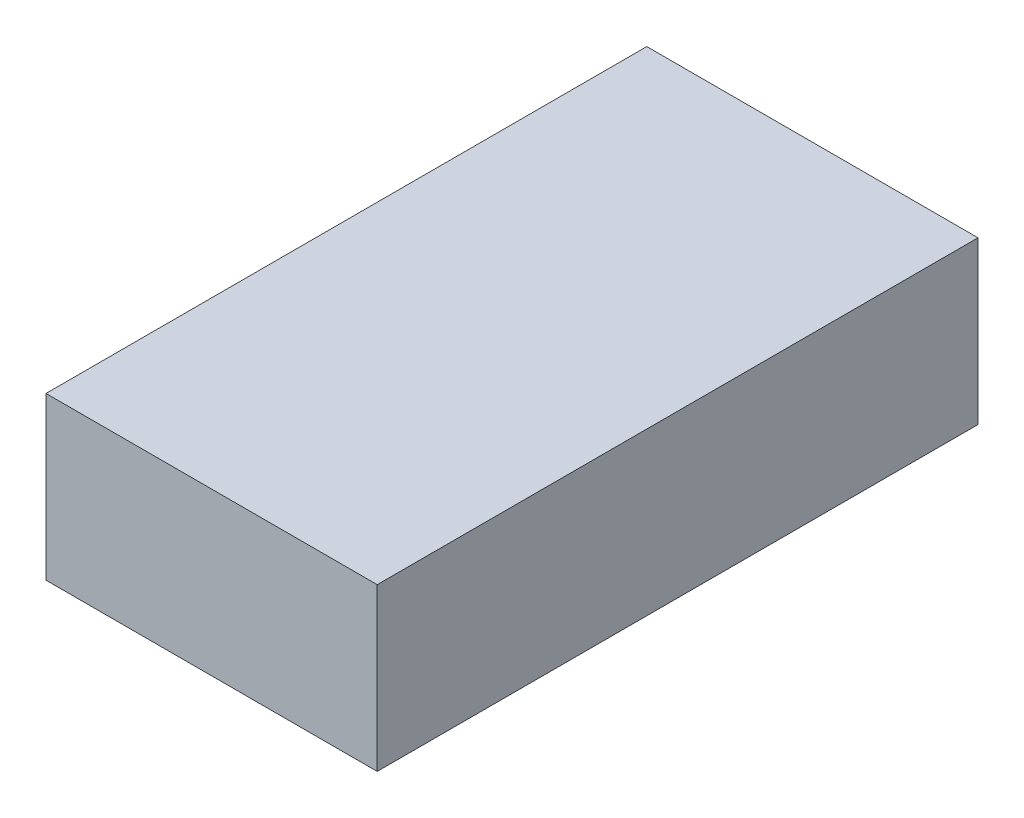
ISO-10303-21;
HEADER;
FILE_DESCRIPTION(('STEP AP214'),'2;1');
FILE_NAME('part.step','',(''),(''),'','','');
FILE_SCHEMA(('AUTOMOTIVE_DESIGN { 1 0 10303 214 1 1 1 1 }'));
ENDSEC;
DATA;
#1=APPLICATION_CONTEXT('core data for automotive mechanical design processes');
#2=APPLICATION_PROTOCOL_DEFINITION('international standard','automotive_design',2000,#1);
#3=PRODUCT_CONTEXT('',#1,'mechanical');
#4=PRODUCT('Part','Part','',(#3));
#5=PRODUCT_RELATED_PRODUCT_CATEGORY('part','',(#4));
#6=PRODUCT_DEFINITION_FORMATION('','',#4);
#7=PRODUCT_DEFINITION_CONTEXT('part definition',#1,'design');
#8=PRODUCT_DEFINITION('design','',#6,#7);
#9=PRODUCT_DEFINITION_SHAPE('','',#8);
#10=(LENGTH_UNIT() NAMED_UNIT(*) SI_UNIT(.MILLI.,.METRE.));
#11=(NAMED_UNIT(*) PLANE_ANGLE_UNIT() SI_UNIT($,.RADIAN.));
#12=(NAMED_UNIT(*) SI_UNIT($,.STERADIAN.) SOLID_ANGLE_UNIT());
#13=UNCERTAINTY_MEASURE_WITH_UNIT(LENGTH_MEASURE(1.E-05),#10,'distance_accuracy_value','');
#14=(GEOMETRIC_REPRESENTATION_CONTEXT(3) GLOBAL_UNCERTAINTY_ASSIGNED_CONTEXT((#13)) GLOBAL_UNIT_ASSIGNED_CONTEXT((#10,
#11,#12)) REPRESENTATION_CONTEXT('',''));
#15=CARTESIAN_POINT('',(0.,0.,0.));
#16=DIRECTION('',(0.,0.,1.));
#17=DIRECTION('',(1.,0.,0.));
#18=AXIS2_PLACEMENT_3D('',#15,#16,#17);
#19=CARTESIAN_POINT('',(21.5,21.,-39.));
#20=DIRECTION('',(-1.,0.,0.));
#21=DIRECTION('',(0.,0.,1.));
#22=AXIS2_PLACEMENT_3D('',#19,#20,#21);
#23=PLANE('',#22);
#24=DIRECTION('',(0.,0.,-1.));
#25=VECTOR('',#24,1.);
#26=CARTESIAN_POINT('',(21.5,0.,-39.));
#27=LINE('',#26,#25);
#28=CARTESIAN_POINT('',(21.5,0.,39.));
#29=VERTEX_POINT('',#28);
#30=CARTESIAN_POINT('',(21.5,0.,-39.));
#31=VERTEX_POINT('',#30);
#32=EDGE_CURVE('E117',#29,#31,#27,.T.);
#33=ORIENTED_EDGE('',*,*,#32,.T.);
#34=DIRECTION('',(0.,-1.,0.));
#35=VECTOR('',#34,1.);
#36=CARTESIAN_POINT('',(21.5,21.,-39.));
#37=LINE('',#36,#35);
#38=CARTESIAN_POINT('',(21.5,21.,-39.));
#39=VERTEX_POINT('',#38);
#40=EDGE_CURVE('E11',#39,#31,#37,.T.);
#41=ORIENTED_EDGE('',*,*,#40,.F.);
#42=DIRECTION('',(0.,0.,-1.));
#43=VECTOR('',#42,1.);
#44=CARTESIAN_POINT('',(21.5,21.,-39.));
#45=LINE('',#44,#43);
#46=CARTESIAN_POINT('',(21.5,21.,39.));
#47=VERTEX_POINT('',#46);
#48=EDGE_CURVE('E101',#47,#39,#45,.T.);
#49=ORIENTED_EDGE('',*,*,#48,.F.);
#50=DIRECTION('',(0.,-1.,0.));
#51=VECTOR('',#50,1.);
#52=CARTESIAN_POINT('',(21.5,21.,39.));
#53=LINE('',#52,#51);
#54=EDGE_CURVE('E113',#47,#29,#53,.T.);
#55=ORIENTED_EDGE('',*,*,#54,.T.);
#56=EDGE_LOOP('',(#33,#41,#49,#55));
#57=FACE_BOUND('',#56,.T.);
#58=ADVANCED_FACE('F49',(#57),#23,.F.);
#59=CARTESIAN_POINT('',(-21.5,21.,-39.));
#60=DIRECTION('',(0.,0.,1.));
#61=DIRECTION('',(1.,0.,0.));
#62=AXIS2_PLACEMENT_3D('',#59,#60,#61);
#63=PLANE('',#62);
#64=DIRECTION('',(-1.,0.,0.));
#65=VECTOR('',#64,1.);
#66=CARTESIAN_POINT('',(-21.5,0.,-39.));
#67=LINE('',#66,#65);
#68=CARTESIAN_POINT('',(-21.5,0.,-39.));
#69=VERTEX_POINT('',#68);
#70=EDGE_CURVE('E106',#31,#69,#67,.T.);
#71=ORIENTED_EDGE('',*,*,#70,.T.);
#72=DIRECTION('',(0.,-1.,0.));
#73=VECTOR('',#72,1.);
#74=CARTESIAN_POINT('',(-21.5,21.,-39.));
#75=LINE('',#74,#73);
#76=CARTESIAN_POINT('',(-21.5,21.,-39.));
#77=VERTEX_POINT('',#76);
#78=EDGE_CURVE('E58',#77,#69,#75,.T.);
#79=ORIENTED_EDGE('',*,*,#78,.F.);
#80=DIRECTION('',(-1.,0.,0.));
#81=VECTOR('',#80,1.);
#82=CARTESIAN_POINT('',(-21.5,21.,-39.));
#83=LINE('',#82,#81);
#84=EDGE_CURVE('E96',#39,#77,#83,.T.);
#85=ORIENTED_EDGE('',*,*,#84,.F.);
#86=ORIENTED_EDGE('',*,*,#40,.T.);
#87=EDGE_LOOP('',(#71,#79,#85,#86));
#88=FACE_BOUND('',#87,.T.);
#89=ADVANCED_FACE('F105',(#88),#63,.F.);
#90=CARTESIAN_POINT('',(-21.5,21.,-39.));
#91=DIRECTION('',(1.,0.,0.));
#92=DIRECTION('',(0.,0.,-1.));
#93=AXIS2_PLACEMENT_3D('',#90,#91,#92);
#94=PLANE('',#93);
#95=DIRECTION('',(0.,0.,1.));
#96=VECTOR('',#95,1.);
#97=CARTESIAN_POINT('',(-21.5,0.,-39.));
#98=LINE('',#97,#96);
#99=CARTESIAN_POINT('',(-21.5,0.,39.));
#100=VERTEX_POINT('',#99);
#101=EDGE_CURVE('E83',#69,#100,#98,.T.);
#102=ORIENTED_EDGE('',*,*,#101,.T.);
#103=DIRECTION('',(0.,-1.,0.));
#104=VECTOR('',#103,1.);
#105=CARTESIAN_POINT('',(-21.5,21.,39.));
#106=LINE('',#105,#104);
#107=CARTESIAN_POINT('',(-21.5,21.,39.));
#108=VERTEX_POINT('',#107);
#109=EDGE_CURVE('E108',#108,#100,#106,.T.);
#110=ORIENTED_EDGE('',*,*,#109,.F.);
#111=DIRECTION('',(0.,0.,1.));
#112=VECTOR('',#111,1.);
#113=CARTESIAN_POINT('',(-21.5,21.,-39.));
#114=LINE('',#113,#112);
#115=EDGE_CURVE('E99',#77,#108,#114,.T.);
#116=ORIENTED_EDGE('',*,*,#115,.F.);
#117=ORIENTED_EDGE('',*,*,#78,.T.);
#118=EDGE_LOOP('',(#102,#110,#116,#117));
#119=FACE_BOUND('',#118,.T.);
#120=ADVANCED_FACE('F109',(#119),#94,.F.);
#121=CARTESIAN_POINT('',(-21.5,21.,39.));
#122=DIRECTION('',(0.,0.,-1.));
#123=DIRECTION('',(-1.,0.,0.));
#124=AXIS2_PLACEMENT_3D('',#121,#122,#123);
#125=PLANE('',#124);
#126=DIRECTION('',(1.,0.,0.));
#127=VECTOR('',#126,1.);
#128=CARTESIAN_POINT('',(-21.5,0.,39.));
#129=LINE('',#128,#127);
#130=EDGE_CURVE('E89',#100,#29,#129,.T.);
#131=ORIENTED_EDGE('',*,*,#130,.T.);
#132=ORIENTED_EDGE('',*,*,#54,.F.);
#133=DIRECTION('',(1.,0.,0.));
#134=VECTOR('',#133,1.);
#135=CARTESIAN_POINT('',(-21.5,21.,39.));
#136=LINE('',#135,#134);
#137=EDGE_CURVE('E66',#108,#47,#136,.T.);
#138=ORIENTED_EDGE('',*,*,#137,.F.);
#139=ORIENTED_EDGE('',*,*,#109,.T.);
#140=EDGE_LOOP('',(#131,#132,#138,#139));
#141=FACE_BOUND('',#140,.T.);
#142=ADVANCED_FACE('F130',(#141),#125,.F.);
#143=CARTESIAN_POINT('',(0.,21.,0.));
#144=DIRECTION('',(0.,1.,0.));
#145=DIRECTION('',(0.,0.,1.));
#146=AXIS2_PLACEMENT_3D('',#143,#144,#145);
#147=PLANE('',#146);
#148=ORIENTED_EDGE('',*,*,#48,.T.);
#149=ORIENTED_EDGE('',*,*,#84,.T.);
#150=ORIENTED_EDGE('',*,*,#115,.T.);
#151=ORIENTED_EDGE('',*,*,#137,.T.);
#152=EDGE_LOOP('',(#148,#149,#150,#151));
#153=FACE_BOUND('',#152,.T.);
#154=ADVANCED_FACE('F97',(#153),#147,.T.);
#155=CARTESIAN_POINT('',(0.,0.,0.));
#156=DIRECTION('',(0.,1.,0.));
#157=DIRECTION('',(0.,0.,1.));
#158=AXIS2_PLACEMENT_3D('',#155,#156,#157);
#159=PLANE('',#158);
#160=ORIENTED_EDGE('',*,*,#32,.F.);
#161=ORIENTED_EDGE('',*,*,#130,.F.);
#162=ORIENTED_EDGE('',*,*,#101,.F.);
#163=ORIENTED_EDGE('',*,*,#70,.F.);
#164=EDGE_LOOP('',(#160,#161,#162,#163));
#165=FACE_BOUND('',#164,.T.);
#166=ADVANCED_FACE('F133',(#165),#159,.F.);
#167=CLOSED_SHELL('',(#58,#89,#120,#142,#154,#166));
#168=MANIFOLD_SOLID_BREP('B2',#167);
#169=ADVANCED_BREP_SHAPE_REPRESENTATION('',(#18,#168),#14);
#170=SHAPE_DEFINITION_REPRESENTATION(#9,#169);
ENDSEC;
END-ISO-10303-21;
